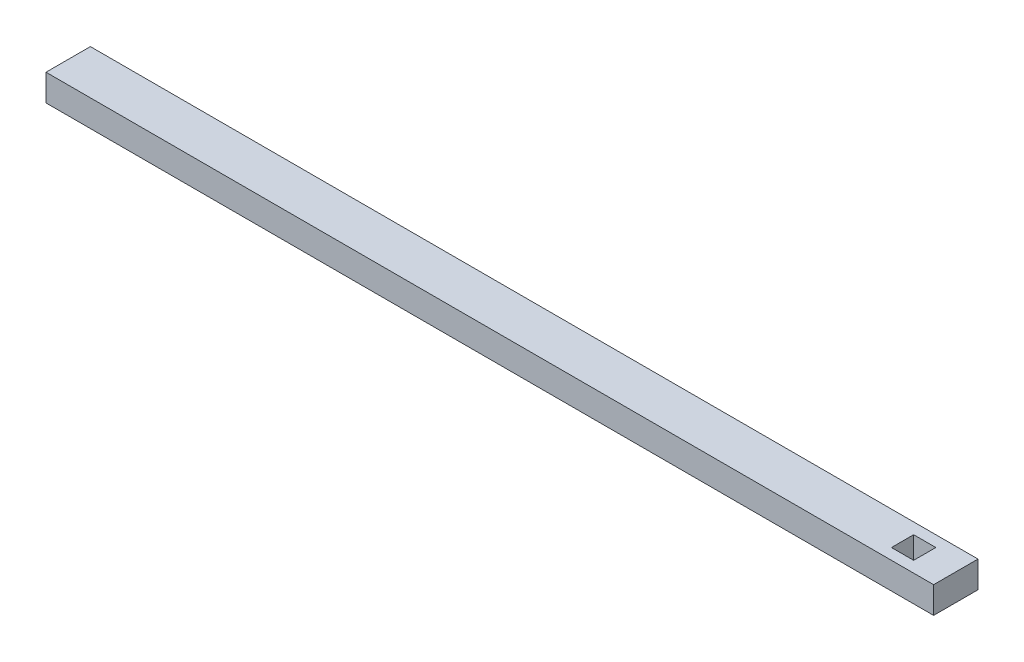
ISO-10303-21;
HEADER;
FILE_DESCRIPTION(('STEP AP214'),'2;1');
FILE_NAME('part.step','',(''),(''),'','','');
FILE_SCHEMA(('AUTOMOTIVE_DESIGN { 1 0 10303 214 1 1 1 1 }'));
ENDSEC;
DATA;
#1=APPLICATION_CONTEXT('core data for automotive mechanical design processes');
#2=APPLICATION_PROTOCOL_DEFINITION('international standard','automotive_design',2000,#1);
#3=PRODUCT_CONTEXT('',#1,'mechanical');
#4=PRODUCT('Part','Part','',(#3));
#5=PRODUCT_RELATED_PRODUCT_CATEGORY('part','',(#4));
#6=PRODUCT_DEFINITION_FORMATION('','',#4);
#7=PRODUCT_DEFINITION_CONTEXT('part definition',#1,'design');
#8=PRODUCT_DEFINITION('design','',#6,#7);
#9=PRODUCT_DEFINITION_SHAPE('','',#8);
#10=(LENGTH_UNIT() NAMED_UNIT(*) SI_UNIT(.MILLI.,.METRE.));
#11=(NAMED_UNIT(*) PLANE_ANGLE_UNIT() SI_UNIT($,.RADIAN.));
#12=(NAMED_UNIT(*) SI_UNIT($,.STERADIAN.) SOLID_ANGLE_UNIT());
#13=UNCERTAINTY_MEASURE_WITH_UNIT(LENGTH_MEASURE(1.E-05),#10,'distance_accuracy_value','');
#14=(GEOMETRIC_REPRESENTATION_CONTEXT(3) GLOBAL_UNCERTAINTY_ASSIGNED_CONTEXT((#13)) GLOBAL_UNIT_ASSIGNED_CONTEXT((#10,
#11,#12)) REPRESENTATION_CONTEXT('',''));
#15=CARTESIAN_POINT('',(0.,0.,0.));
#16=DIRECTION('',(0.,0.,1.));
#17=DIRECTION('',(1.,0.,0.));
#18=AXIS2_PLACEMENT_3D('',#15,#16,#17);
#19=CARTESIAN_POINT('',(100.,6.,5.));
#20=DIRECTION('',(-1.,0.,0.));
#21=DIRECTION('',(0.,0.,1.));
#22=AXIS2_PLACEMENT_3D('',#19,#20,#21);
#23=PLANE('',#22);
#24=DIRECTION('',(0.,0.,-1.));
#25=VECTOR('',#24,1.);
#26=CARTESIAN_POINT('',(100.,0.,5.));
#27=LINE('',#26,#25);
#28=CARTESIAN_POINT('',(100.,0.,5.));
#29=VERTEX_POINT('',#28);
#30=CARTESIAN_POINT('',(100.,0.,-5.));
#31=VERTEX_POINT('',#30);
#32=EDGE_CURVE('E153',#29,#31,#27,.T.);
#33=ORIENTED_EDGE('',*,*,#32,.T.);
#34=DIRECTION('',(0.,-1.,0.));
#35=VECTOR('',#34,1.);
#36=CARTESIAN_POINT('',(100.,6.,-5.));
#37=LINE('',#36,#35);
#38=CARTESIAN_POINT('',(100.,6.,-5.));
#39=VERTEX_POINT('',#38);
#40=EDGE_CURVE('E11',#39,#31,#37,.T.);
#41=ORIENTED_EDGE('',*,*,#40,.F.);
#42=DIRECTION('',(0.,0.,-1.));
#43=VECTOR('',#42,1.);
#44=CARTESIAN_POINT('',(100.,6.,5.));
#45=LINE('',#44,#43);
#46=CARTESIAN_POINT('',(100.,6.,5.));
#47=VERTEX_POINT('',#46);
#48=EDGE_CURVE('E159',#47,#39,#45,.T.);
#49=ORIENTED_EDGE('',*,*,#48,.F.);
#50=DIRECTION('',(0.,-1.,0.));
#51=VECTOR('',#50,1.);
#52=CARTESIAN_POINT('',(100.,6.,5.));
#53=LINE('',#52,#51);
#54=EDGE_CURVE('E173',#47,#29,#53,.T.);
#55=ORIENTED_EDGE('',*,*,#54,.T.);
#56=EDGE_LOOP('',(#33,#41,#49,#55));
#57=FACE_BOUND('',#56,.T.);
#58=ADVANCED_FACE('F45',(#57),#23,.F.);
#59=CARTESIAN_POINT('',(-100.,6.,-5.));
#60=DIRECTION('',(0.,0.,1.));
#61=DIRECTION('',(1.,0.,0.));
#62=AXIS2_PLACEMENT_3D('',#59,#60,#61);
#63=PLANE('',#62);
#64=DIRECTION('',(-1.,0.,0.));
#65=VECTOR('',#64,1.);
#66=CARTESIAN_POINT('',(-100.,0.,-5.));
#67=LINE('',#66,#65);
#68=CARTESIAN_POINT('',(-100.,0.,-5.));
#69=VERTEX_POINT('',#68);
#70=EDGE_CURVE('E177',#31,#69,#67,.T.);
#71=ORIENTED_EDGE('',*,*,#70,.T.);
#72=DIRECTION('',(0.,-1.,0.));
#73=VECTOR('',#72,1.);
#74=CARTESIAN_POINT('',(-100.,6.,-5.));
#75=LINE('',#74,#73);
#76=CARTESIAN_POINT('',(-100.,6.,-5.));
#77=VERTEX_POINT('',#76);
#78=EDGE_CURVE('E53',#77,#69,#75,.T.);
#79=ORIENTED_EDGE('',*,*,#78,.F.);
#80=DIRECTION('',(-1.,0.,0.));
#81=VECTOR('',#80,1.);
#82=CARTESIAN_POINT('',(-100.,6.,-5.));
#83=LINE('',#82,#81);
#84=EDGE_CURVE('E163',#39,#77,#83,.T.);
#85=ORIENTED_EDGE('',*,*,#84,.F.);
#86=ORIENTED_EDGE('',*,*,#40,.T.);
#87=EDGE_LOOP('',(#71,#79,#85,#86));
#88=FACE_BOUND('',#87,.T.);
#89=ADVANCED_FACE('F211',(#88),#63,.F.);
#90=CARTESIAN_POINT('',(-100.,6.,5.));
#91=DIRECTION('',(1.,0.,0.));
#92=DIRECTION('',(0.,0.,-1.));
#93=AXIS2_PLACEMENT_3D('',#90,#91,#92);
#94=PLANE('',#93);
#95=DIRECTION('',(0.,0.,1.));
#96=VECTOR('',#95,1.);
#97=CARTESIAN_POINT('',(-100.,0.,5.));
#98=LINE('',#97,#96);
#99=CARTESIAN_POINT('',(-100.,0.,5.));
#100=VERTEX_POINT('',#99);
#101=EDGE_CURVE('E180',#69,#100,#98,.T.);
#102=ORIENTED_EDGE('',*,*,#101,.T.);
#103=DIRECTION('',(0.,-1.,0.));
#104=VECTOR('',#103,1.);
#105=CARTESIAN_POINT('',(-100.,6.,5.));
#106=LINE('',#105,#104);
#107=CARTESIAN_POINT('',(-100.,6.,5.));
#108=VERTEX_POINT('',#107);
#109=EDGE_CURVE('E188',#108,#100,#106,.T.);
#110=ORIENTED_EDGE('',*,*,#109,.F.);
#111=DIRECTION('',(0.,0.,1.));
#112=VECTOR('',#111,1.);
#113=CARTESIAN_POINT('',(-100.,6.,5.));
#114=LINE('',#113,#112);
#115=EDGE_CURVE('E167',#77,#108,#114,.T.);
#116=ORIENTED_EDGE('',*,*,#115,.F.);
#117=ORIENTED_EDGE('',*,*,#78,.T.);
#118=EDGE_LOOP('',(#102,#110,#116,#117));
#119=FACE_BOUND('',#118,.T.);
#120=ADVANCED_FACE('F197',(#119),#94,.F.);
#121=CARTESIAN_POINT('',(-100.,6.,5.));
#122=DIRECTION('',(0.,0.,-1.));
#123=DIRECTION('',(-1.,0.,0.));
#124=AXIS2_PLACEMENT_3D('',#121,#122,#123);
#125=PLANE('',#124);
#126=DIRECTION('',(1.,0.,0.));
#127=VECTOR('',#126,1.);
#128=CARTESIAN_POINT('',(-100.,0.,5.));
#129=LINE('',#128,#127);
#130=EDGE_CURVE('E164',#100,#29,#129,.T.);
#131=ORIENTED_EDGE('',*,*,#130,.T.);
#132=ORIENTED_EDGE('',*,*,#54,.F.);
#133=DIRECTION('',(1.,0.,0.));
#134=VECTOR('',#133,1.);
#135=CARTESIAN_POINT('',(-100.,6.,5.));
#136=LINE('',#135,#134);
#137=EDGE_CURVE('E170',#108,#47,#136,.T.);
#138=ORIENTED_EDGE('',*,*,#137,.F.);
#139=ORIENTED_EDGE('',*,*,#109,.T.);
#140=EDGE_LOOP('',(#131,#132,#138,#139));
#141=FACE_BOUND('',#140,.T.);
#142=ADVANCED_FACE('F204',(#141),#125,.F.);
#143=CARTESIAN_POINT('',(0.,6.,0.));
#144=DIRECTION('',(0.,-1.,0.));
#145=DIRECTION('',(0.,0.,-1.));
#146=AXIS2_PLACEMENT_3D('',#143,#144,#145);
#147=PLANE('',#146);
#148=DIRECTION('',(-1.,0.,0.));
#149=VECTOR('',#148,1.);
#150=CARTESIAN_POINT('',(93.,6.,-2.5));
#151=LINE('',#150,#149);
#152=CARTESIAN_POINT('',(93.,6.,-2.5));
#153=VERTEX_POINT('',#152);
#154=CARTESIAN_POINT('',(88.,6.,-2.5));
#155=VERTEX_POINT('',#154);
#156=EDGE_CURVE('E144',#153,#155,#151,.T.);
#157=ORIENTED_EDGE('',*,*,#156,.F.);
#158=DIRECTION('',(0.,0.,-1.));
#159=VECTOR('',#158,1.);
#160=CARTESIAN_POINT('',(93.,6.,-2.5));
#161=LINE('',#160,#159);
#162=CARTESIAN_POINT('',(93.,6.,2.5));
#163=VERTEX_POINT('',#162);
#164=EDGE_CURVE('E60',#163,#153,#161,.T.);
#165=ORIENTED_EDGE('',*,*,#164,.F.);
#166=DIRECTION('',(1.,0.,0.));
#167=VECTOR('',#166,1.);
#168=CARTESIAN_POINT('',(93.,6.,2.5));
#169=LINE('',#168,#167);
#170=CARTESIAN_POINT('',(88.,6.,2.5));
#171=VERTEX_POINT('',#170);
#172=EDGE_CURVE('E131',#171,#163,#169,.T.);
#173=ORIENTED_EDGE('',*,*,#172,.F.);
#174=DIRECTION('',(0.,0.,1.));
#175=VECTOR('',#174,1.);
#176=CARTESIAN_POINT('',(88.,6.,-2.5));
#177=LINE('',#176,#175);
#178=EDGE_CURVE('E135',#155,#171,#177,.T.);
#179=ORIENTED_EDGE('',*,*,#178,.F.);
#180=EDGE_LOOP('',(#157,#165,#173,#179));
#181=FACE_BOUND('',#180,.T.);
#182=ORIENTED_EDGE('',*,*,#48,.T.);
#183=ORIENTED_EDGE('',*,*,#84,.T.);
#184=ORIENTED_EDGE('',*,*,#115,.T.);
#185=ORIENTED_EDGE('',*,*,#137,.T.);
#186=EDGE_LOOP('',(#182,#183,#184,#185));
#187=FACE_BOUND('',#186,.T.);
#188=ADVANCED_FACE('F210',(#181,#187),#147,.F.);
#189=CARTESIAN_POINT('',(0.,0.,0.));
#190=DIRECTION('',(0.,-1.,0.));
#191=DIRECTION('',(0.,0.,-1.));
#192=AXIS2_PLACEMENT_3D('',#189,#190,#191);
#193=PLANE('',#192);
#194=DIRECTION('',(0.,0.,-1.));
#195=VECTOR('',#194,1.);
#196=CARTESIAN_POINT('',(93.,0.,-2.5));
#197=LINE('',#196,#195);
#198=CARTESIAN_POINT('',(93.,0.,2.5));
#199=VERTEX_POINT('',#198);
#200=CARTESIAN_POINT('',(93.,0.,-2.5));
#201=VERTEX_POINT('',#200);
#202=EDGE_CURVE('E112',#199,#201,#197,.T.);
#203=ORIENTED_EDGE('',*,*,#202,.T.);
#204=DIRECTION('',(-1.,0.,0.));
#205=VECTOR('',#204,1.);
#206=CARTESIAN_POINT('',(93.,0.,-2.5));
#207=LINE('',#206,#205);
#208=CARTESIAN_POINT('',(88.,0.,-2.5));
#209=VERTEX_POINT('',#208);
#210=EDGE_CURVE('E122',#201,#209,#207,.T.);
#211=ORIENTED_EDGE('',*,*,#210,.T.);
#212=DIRECTION('',(0.,0.,1.));
#213=VECTOR('',#212,1.);
#214=CARTESIAN_POINT('',(88.,0.,-2.5));
#215=LINE('',#214,#213);
#216=CARTESIAN_POINT('',(88.,0.,2.5));
#217=VERTEX_POINT('',#216);
#218=EDGE_CURVE('E68',#209,#217,#215,.T.);
#219=ORIENTED_EDGE('',*,*,#218,.T.);
#220=DIRECTION('',(1.,0.,0.));
#221=VECTOR('',#220,1.);
#222=CARTESIAN_POINT('',(93.,0.,2.5));
#223=LINE('',#222,#221);
#224=EDGE_CURVE('E119',#217,#199,#223,.T.);
#225=ORIENTED_EDGE('',*,*,#224,.T.);
#226=EDGE_LOOP('',(#203,#211,#219,#225));
#227=FACE_BOUND('',#226,.T.);
#228=ORIENTED_EDGE('',*,*,#32,.F.);
#229=ORIENTED_EDGE('',*,*,#130,.F.);
#230=ORIENTED_EDGE('',*,*,#101,.F.);
#231=ORIENTED_EDGE('',*,*,#70,.F.);
#232=EDGE_LOOP('',(#228,#229,#230,#231));
#233=FACE_BOUND('',#232,.T.);
#234=ADVANCED_FACE('F127',(#227,#233),#193,.T.);
#235=CARTESIAN_POINT('',(93.,0.,-2.5));
#236=DIRECTION('',(1.,0.,0.));
#237=DIRECTION('',(0.,0.,-1.));
#238=AXIS2_PLACEMENT_3D('',#235,#236,#237);
#239=PLANE('',#238);
#240=ORIENTED_EDGE('',*,*,#164,.T.);
#241=DIRECTION('',(0.,1.,0.));
#242=VECTOR('',#241,1.);
#243=CARTESIAN_POINT('',(93.,0.,-2.5));
#244=LINE('',#243,#242);
#245=EDGE_CURVE('E108',#201,#153,#244,.T.);
#246=ORIENTED_EDGE('',*,*,#245,.F.);
#247=ORIENTED_EDGE('',*,*,#202,.F.);
#248=DIRECTION('',(0.,1.,0.));
#249=VECTOR('',#248,1.);
#250=CARTESIAN_POINT('',(93.,0.,2.5));
#251=LINE('',#250,#249);
#252=EDGE_CURVE('E150',#199,#163,#251,.T.);
#253=ORIENTED_EDGE('',*,*,#252,.T.);
#254=EDGE_LOOP('',(#240,#246,#247,#253));
#255=FACE_BOUND('',#254,.T.);
#256=ADVANCED_FACE('F110',(#255),#239,.F.);
#257=CARTESIAN_POINT('',(93.,0.,2.5));
#258=DIRECTION('',(0.,0.,1.));
#259=DIRECTION('',(1.,0.,0.));
#260=AXIS2_PLACEMENT_3D('',#257,#258,#259);
#261=PLANE('',#260);
#262=ORIENTED_EDGE('',*,*,#172,.T.);
#263=ORIENTED_EDGE('',*,*,#252,.F.);
#264=ORIENTED_EDGE('',*,*,#224,.F.);
#265=DIRECTION('',(0.,1.,0.));
#266=VECTOR('',#265,1.);
#267=CARTESIAN_POINT('',(88.,0.,2.5));
#268=LINE('',#267,#266);
#269=EDGE_CURVE('E154',#217,#171,#268,.T.);
#270=ORIENTED_EDGE('',*,*,#269,.T.);
#271=EDGE_LOOP('',(#262,#263,#264,#270));
#272=FACE_BOUND('',#271,.T.);
#273=ADVANCED_FACE('F228',(#272),#261,.F.);
#274=CARTESIAN_POINT('',(88.,0.,-2.5));
#275=DIRECTION('',(-1.,0.,0.));
#276=DIRECTION('',(0.,0.,1.));
#277=AXIS2_PLACEMENT_3D('',#274,#275,#276);
#278=PLANE('',#277);
#279=ORIENTED_EDGE('',*,*,#178,.T.);
#280=ORIENTED_EDGE('',*,*,#269,.F.);
#281=ORIENTED_EDGE('',*,*,#218,.F.);
#282=DIRECTION('',(0.,1.,0.));
#283=VECTOR('',#282,1.);
#284=CARTESIAN_POINT('',(88.,0.,-2.5));
#285=LINE('',#284,#283);
#286=EDGE_CURVE('E118',#209,#155,#285,.T.);
#287=ORIENTED_EDGE('',*,*,#286,.T.);
#288=EDGE_LOOP('',(#279,#280,#281,#287));
#289=FACE_BOUND('',#288,.T.);
#290=ADVANCED_FACE('F231',(#289),#278,.F.);
#291=CARTESIAN_POINT('',(93.,0.,-2.5));
#292=DIRECTION('',(0.,0.,-1.));
#293=DIRECTION('',(-1.,0.,0.));
#294=AXIS2_PLACEMENT_3D('',#291,#292,#293);
#295=PLANE('',#294);
#296=ORIENTED_EDGE('',*,*,#156,.T.);
#297=ORIENTED_EDGE('',*,*,#286,.F.);
#298=ORIENTED_EDGE('',*,*,#210,.F.);
#299=ORIENTED_EDGE('',*,*,#245,.T.);
#300=EDGE_LOOP('',(#296,#297,#298,#299));
#301=FACE_BOUND('',#300,.T.);
#302=ADVANCED_FACE('F123',(#301),#295,.F.);
#303=CLOSED_SHELL('',(#58,#89,#120,#142,#188,#234,#256,#273,#290,#302));
#304=MANIFOLD_SOLID_BREP('B2',#303);
#305=ADVANCED_BREP_SHAPE_REPRESENTATION('',(#18,#304),#14);
#306=SHAPE_DEFINITION_REPRESENTATION(#9,#305);
ENDSEC;
END-ISO-10303-21;
